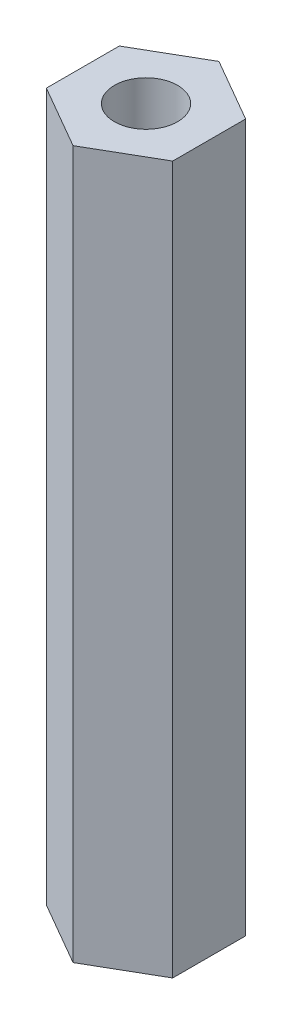
ISO-10303-21;
HEADER;
FILE_DESCRIPTION(('STEP AP214'),'2;1');
FILE_NAME('part.step','',(''),(''),'','','');
FILE_SCHEMA(('AUTOMOTIVE_DESIGN { 1 0 10303 214 1 1 1 1 }'));
ENDSEC;
DATA;
#1=APPLICATION_CONTEXT('core data for automotive mechanical design processes');
#2=APPLICATION_PROTOCOL_DEFINITION('international standard','automotive_design',2000,#1);
#3=PRODUCT_CONTEXT('',#1,'mechanical');
#4=PRODUCT('Part','Part','',(#3));
#5=PRODUCT_RELATED_PRODUCT_CATEGORY('part','',(#4));
#6=PRODUCT_DEFINITION_FORMATION('','',#4);
#7=PRODUCT_DEFINITION_CONTEXT('part definition',#1,'design');
#8=PRODUCT_DEFINITION('design','',#6,#7);
#9=PRODUCT_DEFINITION_SHAPE('','',#8);
#10=(LENGTH_UNIT() NAMED_UNIT(*) SI_UNIT(.MILLI.,.METRE.));
#11=(NAMED_UNIT(*) PLANE_ANGLE_UNIT() SI_UNIT($,.RADIAN.));
#12=(NAMED_UNIT(*) SI_UNIT($,.STERADIAN.) SOLID_ANGLE_UNIT());
#13=UNCERTAINTY_MEASURE_WITH_UNIT(LENGTH_MEASURE(1.E-05),#10,'distance_accuracy_value','');
#14=(GEOMETRIC_REPRESENTATION_CONTEXT(3) GLOBAL_UNCERTAINTY_ASSIGNED_CONTEXT((#13)) GLOBAL_UNIT_ASSIGNED_CONTEXT((#10,
#11,#12)) REPRESENTATION_CONTEXT('',''));
#15=CARTESIAN_POINT('',(0.,0.,0.));
#16=DIRECTION('',(0.,0.,1.));
#17=DIRECTION('',(1.,0.,0.));
#18=AXIS2_PLACEMENT_3D('',#15,#16,#17);
#19=CARTESIAN_POINT('',(-6.35,71.12,3.66617420935412));
#20=DIRECTION('',(0.5,0.,-0.866025403784439));
#21=DIRECTION('',(-0.866025403784439,0.,-0.5));
#22=AXIS2_PLACEMENT_3D('',#19,#20,#21);
#23=PLANE('',#22);
#24=DIRECTION('',(0.866025403784439,0.,0.5));
#25=VECTOR('',#24,1.);
#26=CARTESIAN_POINT('',(-6.35,0.,3.66617420935412));
#27=LINE('',#26,#25);
#28=CARTESIAN_POINT('',(-6.35,0.,3.66617420935412));
#29=VERTEX_POINT('',#28);
#30=CARTESIAN_POINT('',(0.,0.,7.33234841870824));
#31=VERTEX_POINT('',#30);
#32=EDGE_CURVE('E132',#29,#31,#27,.T.);
#33=ORIENTED_EDGE('',*,*,#32,.T.);
#34=DIRECTION('',(0.,-1.,0.));
#35=VECTOR('',#34,1.);
#36=CARTESIAN_POINT('',(0.,71.12,7.33234841870824));
#37=LINE('',#36,#35);
#38=CARTESIAN_POINT('',(0.,71.12,7.33234841870824));
#39=VERTEX_POINT('',#38);
#40=EDGE_CURVE('E11',#39,#31,#37,.T.);
#41=ORIENTED_EDGE('',*,*,#40,.F.);
#42=DIRECTION('',(0.866025403784439,0.,0.5));
#43=VECTOR('',#42,1.);
#44=CARTESIAN_POINT('',(-6.35,71.12,3.66617420935412));
#45=LINE('',#44,#43);
#46=CARTESIAN_POINT('',(-6.35,71.12,3.66617420935412));
#47=VERTEX_POINT('',#46);
#48=EDGE_CURVE('E149',#47,#39,#45,.T.);
#49=ORIENTED_EDGE('',*,*,#48,.F.);
#50=DIRECTION('',(0.,-1.,0.));
#51=VECTOR('',#50,1.);
#52=CARTESIAN_POINT('',(-6.35,71.12,3.66617420935412));
#53=LINE('',#52,#51);
#54=EDGE_CURVE('E128',#47,#29,#53,.T.);
#55=ORIENTED_EDGE('',*,*,#54,.T.);
#56=EDGE_LOOP('',(#33,#41,#49,#55));
#57=FACE_BOUND('',#56,.T.);
#58=ADVANCED_FACE('F43',(#57),#23,.F.);
#59=CARTESIAN_POINT('',(0.,71.12,7.33234841870824));
#60=DIRECTION('',(-0.5,0.,-0.866025403784439));
#61=DIRECTION('',(-0.866025403784439,0.,0.5));
#62=AXIS2_PLACEMENT_3D('',#59,#60,#61);
#63=PLANE('',#62);
#64=DIRECTION('',(0.866025403784439,0.,-0.5));
#65=VECTOR('',#64,1.);
#66=CARTESIAN_POINT('',(0.,0.,7.33234841870824));
#67=LINE('',#66,#65);
#68=CARTESIAN_POINT('',(6.35,0.,3.66617420935412));
#69=VERTEX_POINT('',#68);
#70=EDGE_CURVE('E136',#31,#69,#67,.T.);
#71=ORIENTED_EDGE('',*,*,#70,.T.);
#72=DIRECTION('',(0.,-1.,0.));
#73=VECTOR('',#72,1.);
#74=CARTESIAN_POINT('',(6.35,71.12,3.66617420935412));
#75=LINE('',#74,#73);
#76=CARTESIAN_POINT('',(6.35,71.12,3.66617420935412));
#77=VERTEX_POINT('',#76);
#78=EDGE_CURVE('E52',#77,#69,#75,.T.);
#79=ORIENTED_EDGE('',*,*,#78,.F.);
#80=DIRECTION('',(0.866025403784439,0.,-0.5));
#81=VECTOR('',#80,1.);
#82=CARTESIAN_POINT('',(0.,71.12,7.33234841870824));
#83=LINE('',#82,#81);
#84=EDGE_CURVE('E97',#39,#77,#83,.T.);
#85=ORIENTED_EDGE('',*,*,#84,.F.);
#86=ORIENTED_EDGE('',*,*,#40,.T.);
#87=EDGE_LOOP('',(#71,#79,#85,#86));
#88=FACE_BOUND('',#87,.T.);
#89=ADVANCED_FACE('F178',(#88),#63,.F.);
#90=CARTESIAN_POINT('',(6.35,71.12,3.66617420935412));
#91=DIRECTION('',(-1.,0.,0.));
#92=DIRECTION('',(0.,0.,1.));
#93=AXIS2_PLACEMENT_3D('',#90,#91,#92);
#94=PLANE('',#93);
#95=DIRECTION('',(0.,0.,-1.));
#96=VECTOR('',#95,1.);
#97=CARTESIAN_POINT('',(6.35,0.,3.66617420935412));
#98=LINE('',#97,#96);
#99=CARTESIAN_POINT('',(6.35,0.,-3.66617420935413));
#100=VERTEX_POINT('',#99);
#101=EDGE_CURVE('E140',#69,#100,#98,.T.);
#102=ORIENTED_EDGE('',*,*,#101,.T.);
#103=DIRECTION('',(0.,-1.,0.));
#104=VECTOR('',#103,1.);
#105=CARTESIAN_POINT('',(6.35,71.12,-3.66617420935413));
#106=LINE('',#105,#104);
#107=CARTESIAN_POINT('',(6.35,71.12,-3.66617420935413));
#108=VERTEX_POINT('',#107);
#109=EDGE_CURVE('E121',#108,#100,#106,.T.);
#110=ORIENTED_EDGE('',*,*,#109,.F.);
#111=DIRECTION('',(0.,0.,-1.));
#112=VECTOR('',#111,1.);
#113=CARTESIAN_POINT('',(6.35,71.12,3.66617420935412));
#114=LINE('',#113,#112);
#115=EDGE_CURVE('E110',#77,#108,#114,.T.);
#116=ORIENTED_EDGE('',*,*,#115,.F.);
#117=ORIENTED_EDGE('',*,*,#78,.T.);
#118=EDGE_LOOP('',(#102,#110,#116,#117));
#119=FACE_BOUND('',#118,.T.);
#120=ADVANCED_FACE('F159',(#119),#94,.F.);
#121=CARTESIAN_POINT('',(6.35,71.12,-3.66617420935413));
#122=DIRECTION('',(-0.5,0.,0.866025403784439));
#123=DIRECTION('',(0.866025403784439,0.,0.5));
#124=AXIS2_PLACEMENT_3D('',#121,#122,#123);
#125=PLANE('',#124);
#126=DIRECTION('',(-0.866025403784439,0.,-0.5));
#127=VECTOR('',#126,1.);
#128=CARTESIAN_POINT('',(6.35,0.,-3.66617420935413));
#129=LINE('',#128,#127);
#130=CARTESIAN_POINT('',(0.,0.,-7.33234841870825));
#131=VERTEX_POINT('',#130);
#132=EDGE_CURVE('E119',#100,#131,#129,.T.);
#133=ORIENTED_EDGE('',*,*,#132,.T.);
#134=DIRECTION('',(0.,-1.,0.));
#135=VECTOR('',#134,1.);
#136=CARTESIAN_POINT('',(0.,71.12,-7.33234841870825));
#137=LINE('',#136,#135);
#138=CARTESIAN_POINT('',(0.,71.12,-7.33234841870825));
#139=VERTEX_POINT('',#138);
#140=EDGE_CURVE('E116',#139,#131,#137,.T.);
#141=ORIENTED_EDGE('',*,*,#140,.F.);
#142=DIRECTION('',(-0.866025403784439,0.,-0.5));
#143=VECTOR('',#142,1.);
#144=CARTESIAN_POINT('',(6.35,71.12,-3.66617420935413));
#145=LINE('',#144,#143);
#146=EDGE_CURVE('E104',#108,#139,#145,.T.);
#147=ORIENTED_EDGE('',*,*,#146,.F.);
#148=ORIENTED_EDGE('',*,*,#109,.T.);
#149=EDGE_LOOP('',(#133,#141,#147,#148));
#150=FACE_BOUND('',#149,.T.);
#151=ADVANCED_FACE('F117',(#150),#125,.F.);
#152=CARTESIAN_POINT('',(0.,71.12,-7.33234841870825));
#153=DIRECTION('',(0.5,0.,0.866025403784439));
#154=DIRECTION('',(0.866025403784439,0.,-0.5));
#155=AXIS2_PLACEMENT_3D('',#152,#153,#154);
#156=PLANE('',#155);
#157=DIRECTION('',(-0.866025403784439,0.,0.5));
#158=VECTOR('',#157,1.);
#159=CARTESIAN_POINT('',(0.,0.,-7.33234841870825));
#160=LINE('',#159,#158);
#161=CARTESIAN_POINT('',(-6.35,0.,-3.66617420935413));
#162=VERTEX_POINT('',#161);
#163=EDGE_CURVE('E83',#131,#162,#160,.T.);
#164=ORIENTED_EDGE('',*,*,#163,.T.);
#165=DIRECTION('',(0.,-1.,0.));
#166=VECTOR('',#165,1.);
#167=CARTESIAN_POINT('',(-6.35,71.12,-3.66617420935413));
#168=LINE('',#167,#166);
#169=CARTESIAN_POINT('',(-6.35,71.12,-3.66617420935413));
#170=VERTEX_POINT('',#169);
#171=EDGE_CURVE('E122',#170,#162,#168,.T.);
#172=ORIENTED_EDGE('',*,*,#171,.F.);
#173=DIRECTION('',(-0.866025403784439,0.,0.5));
#174=VECTOR('',#173,1.);
#175=CARTESIAN_POINT('',(0.,71.12,-7.33234841870825));
#176=LINE('',#175,#174);
#177=EDGE_CURVE('E108',#139,#170,#176,.T.);
#178=ORIENTED_EDGE('',*,*,#177,.F.);
#179=ORIENTED_EDGE('',*,*,#140,.T.);
#180=EDGE_LOOP('',(#164,#172,#178,#179));
#181=FACE_BOUND('',#180,.T.);
#182=ADVANCED_FACE('F124',(#181),#156,.F.);
#183=CARTESIAN_POINT('',(-6.35,71.12,-3.66617420935413));
#184=DIRECTION('',(1.,0.,0.));
#185=DIRECTION('',(0.,0.,-1.));
#186=AXIS2_PLACEMENT_3D('',#183,#184,#185);
#187=PLANE('',#186);
#188=DIRECTION('',(0.,0.,1.));
#189=VECTOR('',#188,1.);
#190=CARTESIAN_POINT('',(-6.35,0.,-3.66617420935413));
#191=LINE('',#190,#189);
#192=EDGE_CURVE('E89',#162,#29,#191,.T.);
#193=ORIENTED_EDGE('',*,*,#192,.T.);
#194=ORIENTED_EDGE('',*,*,#54,.F.);
#195=DIRECTION('',(0.,0.,1.));
#196=VECTOR('',#195,1.);
#197=CARTESIAN_POINT('',(-6.35,71.12,-3.66617420935413));
#198=LINE('',#197,#196);
#199=EDGE_CURVE('E60',#170,#47,#198,.T.);
#200=ORIENTED_EDGE('',*,*,#199,.F.);
#201=ORIENTED_EDGE('',*,*,#171,.T.);
#202=EDGE_LOOP('',(#193,#194,#200,#201));
#203=FACE_BOUND('',#202,.T.);
#204=ADVANCED_FACE('F166',(#203),#187,.F.);
#205=CARTESIAN_POINT('',(0.,71.12,0.));
#206=DIRECTION('',(0.,1.,0.));
#207=DIRECTION('',(0.,0.,1.));
#208=AXIS2_PLACEMENT_3D('',#205,#206,#207);
#209=PLANE('',#208);
#210=CARTESIAN_POINT('',(0.,71.12,0.));
#211=DIRECTION('',(0.,1.,0.));
#212=DIRECTION('',(0.,0.,1.));
#213=AXIS2_PLACEMENT_3D('',#210,#211,#212);
#214=CIRCLE('',#213,3.175);
#215=CARTESIAN_POINT('',(0.,71.12,3.175));
#216=VERTEX_POINT('',#215);
#217=EDGE_CURVE('E137',#216,#216,#214,.T.);
#218=ORIENTED_EDGE('',*,*,#217,.F.);
#219=EDGE_LOOP('',(#218));
#220=FACE_BOUND('',#219,.T.);
#221=ORIENTED_EDGE('',*,*,#48,.T.);
#222=ORIENTED_EDGE('',*,*,#84,.T.);
#223=ORIENTED_EDGE('',*,*,#115,.T.);
#224=ORIENTED_EDGE('',*,*,#146,.T.);
#225=ORIENTED_EDGE('',*,*,#177,.T.);
#226=ORIENTED_EDGE('',*,*,#199,.T.);
#227=EDGE_LOOP('',(#221,#222,#223,#224,#225,#226));
#228=FACE_BOUND('',#227,.T.);
#229=ADVANCED_FACE('F106',(#220,#228),#209,.T.);
#230=CARTESIAN_POINT('',(0.,0.,0.));
#231=DIRECTION('',(0.,1.,0.));
#232=DIRECTION('',(0.,0.,1.));
#233=AXIS2_PLACEMENT_3D('',#230,#231,#232);
#234=PLANE('',#233);
#235=CARTESIAN_POINT('',(0.,0.,0.));
#236=DIRECTION('',(0.,1.,0.));
#237=DIRECTION('',(0.,0.,1.));
#238=AXIS2_PLACEMENT_3D('',#235,#236,#237);
#239=CIRCLE('',#238,3.175);
#240=CARTESIAN_POINT('',(0.,0.,3.175));
#241=VERTEX_POINT('',#240);
#242=EDGE_CURVE('E265',#241,#241,#239,.T.);
#243=ORIENTED_EDGE('',*,*,#242,.T.);
#244=EDGE_LOOP('',(#243));
#245=FACE_BOUND('',#244,.T.);
#246=ORIENTED_EDGE('',*,*,#32,.F.);
#247=ORIENTED_EDGE('',*,*,#192,.F.);
#248=ORIENTED_EDGE('',*,*,#163,.F.);
#249=ORIENTED_EDGE('',*,*,#132,.F.);
#250=ORIENTED_EDGE('',*,*,#101,.F.);
#251=ORIENTED_EDGE('',*,*,#70,.F.);
#252=EDGE_LOOP('',(#246,#247,#248,#249,#250,#251));
#253=FACE_BOUND('',#252,.T.);
#254=ADVANCED_FACE('F162',(#245,#253),#234,.F.);
#255=CARTESIAN_POINT('',(0.,0.,0.));
#256=DIRECTION('',(0.,1.,0.));
#257=DIRECTION('',(0.,0.,1.));
#258=AXIS2_PLACEMENT_3D('',#255,#256,#257);
#259=CYLINDRICAL_SURFACE('',#258,3.175);
#260=ORIENTED_EDGE('',*,*,#217,.T.);
#261=EDGE_LOOP('',(#260));
#262=FACE_BOUND('',#261,.T.);
#263=ORIENTED_EDGE('',*,*,#242,.F.);
#264=EDGE_LOOP('',(#263));
#265=FACE_BOUND('',#264,.T.);
#266=ADVANCED_FACE('F218',(#262,#265),#259,.F.);
#267=CLOSED_SHELL('',(#58,#89,#120,#151,#182,#204,#229,#254,#266));
#268=MANIFOLD_SOLID_BREP('B2',#267);
#269=ADVANCED_BREP_SHAPE_REPRESENTATION('',(#18,#268),#14);
#270=SHAPE_DEFINITION_REPRESENTATION(#9,#269);
ENDSEC;
END-ISO-10303-21;
